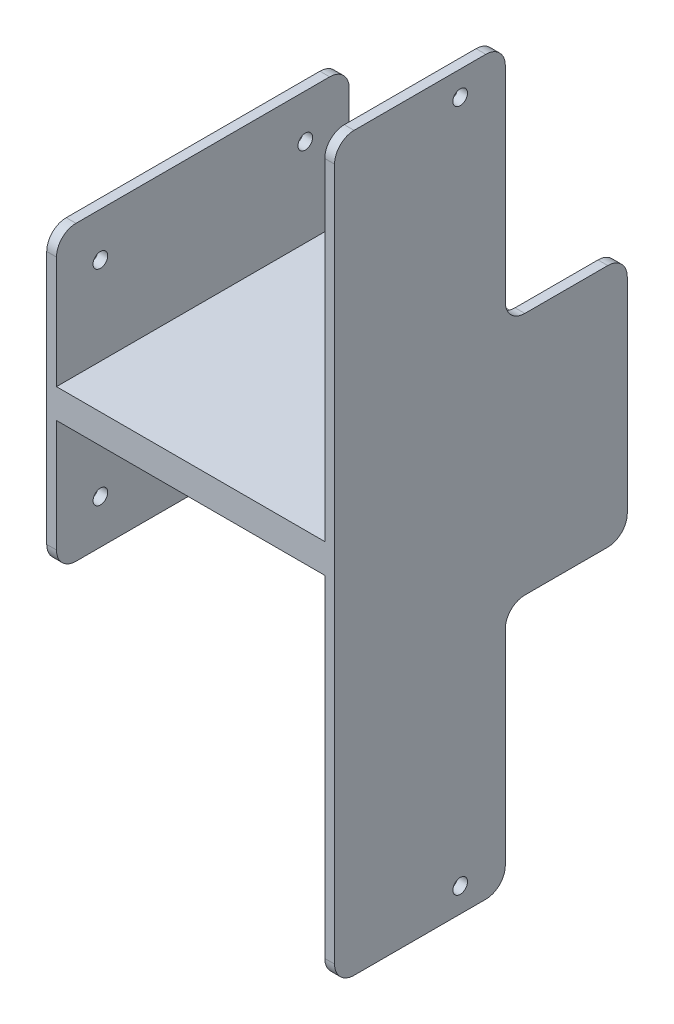
ISO-10303-21;
HEADER;
FILE_DESCRIPTION(('STEP AP214'),'2;1');
FILE_NAME('part.step','',(''),(''),'','','');
FILE_SCHEMA(('AUTOMOTIVE_DESIGN { 1 0 10303 214 1 1 1 1 }'));
ENDSEC;
DATA;
#1=APPLICATION_CONTEXT('core data for automotive mechanical design processes');
#2=APPLICATION_PROTOCOL_DEFINITION('international standard','automotive_design',2000,#1);
#3=PRODUCT_CONTEXT('',#1,'mechanical');
#4=PRODUCT('Part','Part','',(#3));
#5=PRODUCT_RELATED_PRODUCT_CATEGORY('part','',(#4));
#6=PRODUCT_DEFINITION_FORMATION('','',#4);
#7=PRODUCT_DEFINITION_CONTEXT('part definition',#1,'design');
#8=PRODUCT_DEFINITION('design','',#6,#7);
#9=PRODUCT_DEFINITION_SHAPE('','',#8);
#10=(LENGTH_UNIT() NAMED_UNIT(*) SI_UNIT(.MILLI.,.METRE.));
#11=(NAMED_UNIT(*) PLANE_ANGLE_UNIT() SI_UNIT($,.RADIAN.));
#12=(NAMED_UNIT(*) SI_UNIT($,.STERADIAN.) SOLID_ANGLE_UNIT());
#13=UNCERTAINTY_MEASURE_WITH_UNIT(LENGTH_MEASURE(1.E-05),#10,'distance_accuracy_value','');
#14=(GEOMETRIC_REPRESENTATION_CONTEXT(3) GLOBAL_UNCERTAINTY_ASSIGNED_CONTEXT((#13)) GLOBAL_UNIT_ASSIGNED_CONTEXT((#10,
#11,#12)) REPRESENTATION_CONTEXT('',''));
#15=CARTESIAN_POINT('',(0.,0.,0.));
#16=DIRECTION('',(0.,0.,1.));
#17=DIRECTION('',(1.,0.,0.));
#18=AXIS2_PLACEMENT_3D('',#15,#16,#17);
#19=CARTESIAN_POINT('',(-29.5,30.,60.));
#20=DIRECTION('',(1.,0.,0.));
#21=DIRECTION('',(0.,1.,0.));
#22=AXIS2_PLACEMENT_3D('',#19,#20,#21);
#23=PLANE('',#22);
#24=CARTESIAN_POINT('',(-29.5,-21.,51.));
#25=DIRECTION('',(-1.,0.,0.));
#26=DIRECTION('',(0.,-1.,0.));
#27=AXIS2_PLACEMENT_3D('',#24,#25,#26);
#28=CIRCLE('',#27,1.5);
#29=CARTESIAN_POINT('',(-29.5,-22.5,51.));
#30=VERTEX_POINT('',#29);
#31=EDGE_CURVE('E508',#30,#30,#28,.T.);
#32=ORIENTED_EDGE('',*,*,#31,.F.);
#33=EDGE_LOOP('',(#32));
#34=FACE_BOUND('',#33,.T.);
#35=CARTESIAN_POINT('',(-29.5,21.,9.));
#36=DIRECTION('',(-1.,0.,0.));
#37=DIRECTION('',(0.,-1.,0.));
#38=AXIS2_PLACEMENT_3D('',#35,#36,#37);
#39=CIRCLE('',#38,1.5);
#40=CARTESIAN_POINT('',(-29.5,19.5,9.));
#41=VERTEX_POINT('',#40);
#42=EDGE_CURVE('E509',#41,#41,#39,.T.);
#43=ORIENTED_EDGE('',*,*,#42,.F.);
#44=EDGE_LOOP('',(#43));
#45=FACE_BOUND('',#44,.T.);
#46=CARTESIAN_POINT('',(-29.5,-21.,9.00000000000001));
#47=DIRECTION('',(-1.,0.,0.));
#48=DIRECTION('',(0.,-1.,0.));
#49=AXIS2_PLACEMENT_3D('',#46,#47,#48);
#50=CIRCLE('',#49,1.5);
#51=CARTESIAN_POINT('',(-29.5,-22.5,9.00000000000001));
#52=VERTEX_POINT('',#51);
#53=EDGE_CURVE('E512',#52,#52,#50,.T.);
#54=ORIENTED_EDGE('',*,*,#53,.F.);
#55=EDGE_LOOP('',(#54));
#56=FACE_BOUND('',#55,.T.);
#57=CARTESIAN_POINT('',(-29.5,21.,51.));
#58=DIRECTION('',(-1.,0.,0.));
#59=DIRECTION('',(0.,-1.,0.));
#60=AXIS2_PLACEMENT_3D('',#57,#58,#59);
#61=CIRCLE('',#60,1.5);
#62=CARTESIAN_POINT('',(-29.5,19.5,51.));
#63=VERTEX_POINT('',#62);
#64=EDGE_CURVE('E318',#63,#63,#61,.T.);
#65=ORIENTED_EDGE('',*,*,#64,.F.);
#66=EDGE_LOOP('',(#65));
#67=FACE_BOUND('',#66,.T.);
#68=DIRECTION('',(0.,-1.,0.));
#69=VECTOR('',#68,1.);
#70=CARTESIAN_POINT('',(-29.5,30.,60.));
#71=LINE('',#70,#69);
#72=CARTESIAN_POINT('',(-29.5,26.,60.));
#73=VERTEX_POINT('',#72);
#74=CARTESIAN_POINT('',(-29.5,-26.,60.));
#75=VERTEX_POINT('',#74);
#76=EDGE_CURVE('E234',#73,#75,#71,.T.);
#77=ORIENTED_EDGE('',*,*,#76,.F.);
#78=CARTESIAN_POINT('',(-29.5,26.,56.));
#79=DIRECTION('',(1.,0.,0.));
#80=DIRECTION('',(0.,1.,0.));
#81=AXIS2_PLACEMENT_3D('',#78,#79,#80);
#82=CIRCLE('',#81,4.);
#83=CARTESIAN_POINT('',(-29.5,30.,56.));
#84=VERTEX_POINT('',#83);
#85=EDGE_CURVE('E355',#73,#84,#82,.F.);
#86=ORIENTED_EDGE('',*,*,#85,.T.);
#87=DIRECTION('',(0.,0.,-1.));
#88=VECTOR('',#87,1.);
#89=CARTESIAN_POINT('',(-29.5,30.,60.));
#90=LINE('',#89,#88);
#91=CARTESIAN_POINT('',(-29.5,30.,4.));
#92=VERTEX_POINT('',#91);
#93=EDGE_CURVE('E263',#84,#92,#90,.T.);
#94=ORIENTED_EDGE('',*,*,#93,.T.);
#95=CARTESIAN_POINT('',(-29.5,26.,4.));
#96=DIRECTION('',(1.,0.,0.));
#97=DIRECTION('',(0.,1.,0.));
#98=AXIS2_PLACEMENT_3D('',#95,#96,#97);
#99=CIRCLE('',#98,4.);
#100=CARTESIAN_POINT('',(-29.5,26.,0.));
#101=VERTEX_POINT('',#100);
#102=EDGE_CURVE('E351',#92,#101,#99,.F.);
#103=ORIENTED_EDGE('',*,*,#102,.T.);
#104=DIRECTION('',(0.,-1.,0.));
#105=VECTOR('',#104,1.);
#106=CARTESIAN_POINT('',(-29.5,30.,0.));
#107=LINE('',#106,#105);
#108=CARTESIAN_POINT('',(-29.5,-26.,0.));
#109=VERTEX_POINT('',#108);
#110=EDGE_CURVE('E264',#101,#109,#107,.T.);
#111=ORIENTED_EDGE('',*,*,#110,.T.);
#112=CARTESIAN_POINT('',(-29.5,-26.,4.));
#113=DIRECTION('',(1.,0.,0.));
#114=DIRECTION('',(0.,1.,0.));
#115=AXIS2_PLACEMENT_3D('',#112,#113,#114);
#116=CIRCLE('',#115,4.);
#117=CARTESIAN_POINT('',(-29.5,-30.,4.));
#118=VERTEX_POINT('',#117);
#119=EDGE_CURVE('E349',#109,#118,#116,.F.);
#120=ORIENTED_EDGE('',*,*,#119,.T.);
#121=DIRECTION('',(0.,0.,-1.));
#122=VECTOR('',#121,1.);
#123=CARTESIAN_POINT('',(-29.5,-30.,60.));
#124=LINE('',#123,#122);
#125=CARTESIAN_POINT('',(-29.5,-30.,56.));
#126=VERTEX_POINT('',#125);
#127=EDGE_CURVE('E310',#126,#118,#124,.T.);
#128=ORIENTED_EDGE('',*,*,#127,.F.);
#129=CARTESIAN_POINT('',(-29.5,-26.,56.));
#130=DIRECTION('',(1.,0.,0.));
#131=DIRECTION('',(0.,1.,0.));
#132=AXIS2_PLACEMENT_3D('',#129,#130,#131);
#133=CIRCLE('',#132,4.);
#134=EDGE_CURVE('E353',#126,#75,#133,.F.);
#135=ORIENTED_EDGE('',*,*,#134,.T.);
#136=EDGE_LOOP('',(#77,#86,#94,#103,#111,#120,#128,#135));
#137=FACE_BOUND('',#136,.T.);
#138=ADVANCED_FACE('F37',(#34,#45,#56,#67,#137),#23,.F.);
#139=CARTESIAN_POINT('',(-29.5,-30.,60.));
#140=DIRECTION('',(0.,1.,0.));
#141=DIRECTION('',(-1.,0.,0.));
#142=AXIS2_PLACEMENT_3D('',#139,#140,#141);
#143=PLANE('',#142);
#144=DIRECTION('',(0.,0.,-1.));
#145=VECTOR('',#144,1.);
#146=CARTESIAN_POINT('',(-27.5,-30.,60.));
#147=LINE('',#146,#145);
#148=CARTESIAN_POINT('',(-27.5,-30.,56.));
#149=VERTEX_POINT('',#148);
#150=CARTESIAN_POINT('',(-27.5,-30.,4.));
#151=VERTEX_POINT('',#150);
#152=EDGE_CURVE('E243',#149,#151,#147,.T.);
#153=ORIENTED_EDGE('',*,*,#152,.F.);
#154=DIRECTION('',(1.,0.,0.));
#155=VECTOR('',#154,1.);
#156=CARTESIAN_POINT('',(-29.5,-30.,56.));
#157=LINE('',#156,#155);
#158=EDGE_CURVE('E373',#149,#126,#157,.F.);
#159=ORIENTED_EDGE('',*,*,#158,.T.);
#160=ORIENTED_EDGE('',*,*,#127,.T.);
#161=DIRECTION('',(1.,0.,0.));
#162=VECTOR('',#161,1.);
#163=CARTESIAN_POINT('',(-29.5,-30.,4.));
#164=LINE('',#163,#162);
#165=EDGE_CURVE('E370',#118,#151,#164,.T.);
#166=ORIENTED_EDGE('',*,*,#165,.T.);
#167=EDGE_LOOP('',(#153,#159,#160,#166));
#168=FACE_BOUND('',#167,.T.);
#169=ADVANCED_FACE('F501',(#168),#143,.F.);
#170=CARTESIAN_POINT('',(-27.5,-3.,60.));
#171=DIRECTION('',(-1.,0.,0.));
#172=DIRECTION('',(0.,-1.,0.));
#173=AXIS2_PLACEMENT_3D('',#170,#171,#172);
#174=PLANE('',#173);
#175=CARTESIAN_POINT('',(-27.5,-21.,51.));
#176=DIRECTION('',(-1.,0.,0.));
#177=DIRECTION('',(0.,-1.,0.));
#178=AXIS2_PLACEMENT_3D('',#175,#176,#177);
#179=CIRCLE('',#178,1.5);
#180=CARTESIAN_POINT('',(-27.5,-22.5,51.));
#181=VERTEX_POINT('',#180);
#182=EDGE_CURVE('E267',#181,#181,#179,.T.);
#183=ORIENTED_EDGE('',*,*,#182,.T.);
#184=EDGE_LOOP('',(#183));
#185=FACE_BOUND('',#184,.T.);
#186=CARTESIAN_POINT('',(-27.5,-21.,9.00000000000001));
#187=DIRECTION('',(-1.,0.,0.));
#188=DIRECTION('',(0.,-1.,0.));
#189=AXIS2_PLACEMENT_3D('',#186,#187,#188);
#190=CIRCLE('',#189,1.5);
#191=CARTESIAN_POINT('',(-27.5,-22.5,9.00000000000001));
#192=VERTEX_POINT('',#191);
#193=EDGE_CURVE('E321',#192,#192,#190,.T.);
#194=ORIENTED_EDGE('',*,*,#193,.T.);
#195=EDGE_LOOP('',(#194));
#196=FACE_BOUND('',#195,.T.);
#197=DIRECTION('',(0.,1.,0.));
#198=VECTOR('',#197,1.);
#199=CARTESIAN_POINT('',(-27.5,-3.,60.));
#200=LINE('',#199,#198);
#201=CARTESIAN_POINT('',(-27.5,-26.,60.));
#202=VERTEX_POINT('',#201);
#203=CARTESIAN_POINT('',(-27.5,-3.,60.));
#204=VERTEX_POINT('',#203);
#205=EDGE_CURVE('E222',#202,#204,#200,.T.);
#206=ORIENTED_EDGE('',*,*,#205,.F.);
#207=CARTESIAN_POINT('',(-27.5,-26.,56.));
#208=DIRECTION('',(-1.,0.,0.));
#209=DIRECTION('',(0.,-1.,0.));
#210=AXIS2_PLACEMENT_3D('',#207,#208,#209);
#211=CIRCLE('',#210,4.);
#212=EDGE_CURVE('E368',#202,#149,#211,.F.);
#213=ORIENTED_EDGE('',*,*,#212,.T.);
#214=ORIENTED_EDGE('',*,*,#152,.T.);
#215=CARTESIAN_POINT('',(-27.5,-26.,4.));
#216=DIRECTION('',(-1.,0.,0.));
#217=DIRECTION('',(0.,-1.,0.));
#218=AXIS2_PLACEMENT_3D('',#215,#216,#217);
#219=CIRCLE('',#218,4.);
#220=CARTESIAN_POINT('',(-27.5,-26.,0.));
#221=VERTEX_POINT('',#220);
#222=EDGE_CURVE('E366',#151,#221,#219,.F.);
#223=ORIENTED_EDGE('',*,*,#222,.T.);
#224=DIRECTION('',(0.,1.,0.));
#225=VECTOR('',#224,1.);
#226=CARTESIAN_POINT('',(-27.5,-3.,0.));
#227=LINE('',#226,#225);
#228=CARTESIAN_POINT('',(-27.5,-3.,0.));
#229=VERTEX_POINT('',#228);
#230=EDGE_CURVE('E240',#221,#229,#227,.T.);
#231=ORIENTED_EDGE('',*,*,#230,.T.);
#232=DIRECTION('',(0.,0.,-1.));
#233=VECTOR('',#232,1.);
#234=CARTESIAN_POINT('',(-27.5,-3.,60.));
#235=LINE('',#234,#233);
#236=EDGE_CURVE('E237',#204,#229,#235,.T.);
#237=ORIENTED_EDGE('',*,*,#236,.F.);
#238=EDGE_LOOP('',(#206,#213,#214,#223,#231,#237));
#239=FACE_BOUND('',#238,.T.);
#240=ADVANCED_FACE('F238',(#185,#196,#239),#174,.F.);
#241=CARTESIAN_POINT('',(-27.5,-3.,60.));
#242=DIRECTION('',(0.,1.,0.));
#243=DIRECTION('',(0.,0.,1.));
#244=AXIS2_PLACEMENT_3D('',#241,#242,#243);
#245=PLANE('',#244);
#246=DIRECTION('',(1.,0.,0.));
#247=VECTOR('',#246,1.);
#248=CARTESIAN_POINT('',(-27.5,-3.,0.));
#249=LINE('',#248,#247);
#250=CARTESIAN_POINT('',(27.5,-3.,0.));
#251=VERTEX_POINT('',#250);
#252=EDGE_CURVE('E269',#229,#251,#249,.T.);
#253=ORIENTED_EDGE('',*,*,#252,.T.);
#254=DIRECTION('',(0.,0.,-1.));
#255=VECTOR('',#254,1.);
#256=CARTESIAN_POINT('',(27.5,-3.,60.));
#257=LINE('',#256,#255);
#258=CARTESIAN_POINT('',(27.5,-3.,60.));
#259=VERTEX_POINT('',#258);
#260=EDGE_CURVE('E244',#259,#251,#257,.T.);
#261=ORIENTED_EDGE('',*,*,#260,.F.);
#262=DIRECTION('',(1.,0.,0.));
#263=VECTOR('',#262,1.);
#264=CARTESIAN_POINT('',(-27.5,-3.,60.));
#265=LINE('',#264,#263);
#266=EDGE_CURVE('E228',#204,#259,#265,.T.);
#267=ORIENTED_EDGE('',*,*,#266,.F.);
#268=ORIENTED_EDGE('',*,*,#236,.T.);
#269=EDGE_LOOP('',(#253,#261,#267,#268));
#270=FACE_BOUND('',#269,.T.);
#271=ADVANCED_FACE('F246',(#270),#245,.F.);
#272=CARTESIAN_POINT('',(27.5,-3.,60.));
#273=DIRECTION('',(1.,0.,0.));
#274=DIRECTION('',(0.,1.,0.));
#275=AXIS2_PLACEMENT_3D('',#272,#273,#274);
#276=PLANE('',#275);
#277=CARTESIAN_POINT('',(27.5,-70.,34.25));
#278=DIRECTION('',(-1.,0.,0.));
#279=DIRECTION('',(0.,1.,0.));
#280=AXIS2_PLACEMENT_3D('',#277,#278,#279);
#281=CIRCLE('',#280,1.5);
#282=CARTESIAN_POINT('',(27.5,-68.5,34.25));
#283=VERTEX_POINT('',#282);
#284=EDGE_CURVE('E535',#283,#283,#281,.T.);
#285=ORIENTED_EDGE('',*,*,#284,.F.);
#286=EDGE_LOOP('',(#285));
#287=FACE_BOUND('',#286,.T.);
#288=DIRECTION('',(0.,0.,1.));
#289=VECTOR('',#288,1.);
#290=CARTESIAN_POINT('',(27.5,-74.9999999999965,25.));
#291=LINE('',#290,#289);
#292=CARTESIAN_POINT('',(27.5,-74.9999999999965,29.));
#293=VERTEX_POINT('',#292);
#294=CARTESIAN_POINT('',(27.5,-74.9999999999965,56.));
#295=VERTEX_POINT('',#294);
#296=EDGE_CURVE('E523',#293,#295,#291,.T.);
#297=ORIENTED_EDGE('',*,*,#296,.T.);
#298=CARTESIAN_POINT('',(27.5,-70.9999999999965,56.));
#299=DIRECTION('',(1.,0.,0.));
#300=DIRECTION('',(0.,1.,0.));
#301=AXIS2_PLACEMENT_3D('',#298,#299,#300);
#302=CIRCLE('',#301,4.);
#303=CARTESIAN_POINT('',(27.5,-70.9999999999965,60.));
#304=VERTEX_POINT('',#303);
#305=EDGE_CURVE('E406',#295,#304,#302,.F.);
#306=ORIENTED_EDGE('',*,*,#305,.T.);
#307=DIRECTION('',(0.,-1.,0.));
#308=VECTOR('',#307,1.);
#309=CARTESIAN_POINT('',(27.5,-3.,60.));
#310=LINE('',#309,#308);
#311=EDGE_CURVE('E249',#259,#304,#310,.T.);
#312=ORIENTED_EDGE('',*,*,#311,.F.);
#313=ORIENTED_EDGE('',*,*,#260,.T.);
#314=DIRECTION('',(0.,-1.,0.));
#315=VECTOR('',#314,1.);
#316=CARTESIAN_POINT('',(27.5,-3.,0.));
#317=LINE('',#316,#315);
#318=CARTESIAN_POINT('',(27.5,-21.,0.));
#319=VERTEX_POINT('',#318);
#320=EDGE_CURVE('E271',#251,#319,#317,.T.);
#321=ORIENTED_EDGE('',*,*,#320,.T.);
#322=CARTESIAN_POINT('',(27.5,-21.,4.));
#323=DIRECTION('',(1.,0.,0.));
#324=DIRECTION('',(0.,1.,0.));
#325=AXIS2_PLACEMENT_3D('',#322,#323,#324);
#326=CIRCLE('',#325,4.);
#327=CARTESIAN_POINT('',(27.5,-25.,4.));
#328=VERTEX_POINT('',#327);
#329=EDGE_CURVE('E403',#319,#328,#326,.F.);
#330=ORIENTED_EDGE('',*,*,#329,.T.);
#331=DIRECTION('',(0.,0.,-1.));
#332=VECTOR('',#331,1.);
#333=CARTESIAN_POINT('',(27.5,-25.,60.));
#334=LINE('',#333,#332);
#335=CARTESIAN_POINT('',(27.5,-25.,21.));
#336=VERTEX_POINT('',#335);
#337=EDGE_CURVE('E304',#336,#328,#334,.T.);
#338=ORIENTED_EDGE('',*,*,#337,.F.);
#339=CARTESIAN_POINT('',(27.5,-29.,21.));
#340=DIRECTION('',(1.,0.,0.));
#341=DIRECTION('',(0.,1.,0.));
#342=AXIS2_PLACEMENT_3D('',#339,#340,#341);
#343=CIRCLE('',#342,4.);
#344=CARTESIAN_POINT('',(27.5,-29.,25.));
#345=VERTEX_POINT('',#344);
#346=EDGE_CURVE('E45',#336,#345,#343,.T.);
#347=ORIENTED_EDGE('',*,*,#346,.T.);
#348=DIRECTION('',(0.,-1.,0.));
#349=VECTOR('',#348,1.);
#350=CARTESIAN_POINT('',(27.5,-24.9999999999965,25.));
#351=LINE('',#350,#349);
#352=CARTESIAN_POINT('',(27.5,-70.9999999999965,25.));
#353=VERTEX_POINT('',#352);
#354=EDGE_CURVE('E329',#345,#353,#351,.T.);
#355=ORIENTED_EDGE('',*,*,#354,.T.);
#356=CARTESIAN_POINT('',(27.5,-70.9999999999965,29.));
#357=DIRECTION('',(1.,0.,0.));
#358=DIRECTION('',(0.,1.,0.));
#359=AXIS2_PLACEMENT_3D('',#356,#357,#358);
#360=CIRCLE('',#359,4.);
#361=EDGE_CURVE('E52',#353,#293,#360,.F.);
#362=ORIENTED_EDGE('',*,*,#361,.T.);
#363=EDGE_LOOP('',(#297,#306,#312,#313,#321,#330,#338,#347,#355,#362));
#364=FACE_BOUND('',#363,.T.);
#365=ADVANCED_FACE('F779',(#287,#364),#276,.F.);
#366=CARTESIAN_POINT('',(27.5,-25.,60.));
#367=DIRECTION('',(0.,1.,0.));
#368=DIRECTION('',(0.,0.,1.));
#369=AXIS2_PLACEMENT_3D('',#366,#367,#368);
#370=PLANE('',#369);
#371=DIRECTION('',(0.,0.,-1.));
#372=VECTOR('',#371,1.);
#373=CARTESIAN_POINT('',(29.5,-25.,60.));
#374=LINE('',#373,#372);
#375=CARTESIAN_POINT('',(29.5,-25.,21.));
#376=VERTEX_POINT('',#375);
#377=CARTESIAN_POINT('',(29.5,-25.,4.));
#378=VERTEX_POINT('',#377);
#379=EDGE_CURVE('E301',#376,#378,#374,.T.);
#380=ORIENTED_EDGE('',*,*,#379,.F.);
#381=DIRECTION('',(-1.,0.,0.));
#382=VECTOR('',#381,1.);
#383=CARTESIAN_POINT('',(27.5,-25.,21.));
#384=LINE('',#383,#382);
#385=EDGE_CURVE('E415',#376,#336,#384,.T.);
#386=ORIENTED_EDGE('',*,*,#385,.T.);
#387=ORIENTED_EDGE('',*,*,#337,.T.);
#388=DIRECTION('',(1.,0.,0.));
#389=VECTOR('',#388,1.);
#390=CARTESIAN_POINT('',(27.5,-25.,4.));
#391=LINE('',#390,#389);
#392=EDGE_CURVE('E412',#328,#378,#391,.T.);
#393=ORIENTED_EDGE('',*,*,#392,.T.);
#394=EDGE_LOOP('',(#380,#386,#387,#393));
#395=FACE_BOUND('',#394,.T.);
#396=ADVANCED_FACE('F768',(#395),#370,.F.);
#397=CARTESIAN_POINT('',(29.5,25.,60.));
#398=DIRECTION('',(-1.,0.,0.));
#399=DIRECTION('',(0.,-1.,0.));
#400=AXIS2_PLACEMENT_3D('',#397,#398,#399);
#401=PLANE('',#400);
#402=CARTESIAN_POINT('',(29.5,70.,34.25));
#403=DIRECTION('',(-1.,0.,0.));
#404=DIRECTION('',(0.,-1.,0.));
#405=AXIS2_PLACEMENT_3D('',#402,#403,#404);
#406=CIRCLE('',#405,1.5);
#407=CARTESIAN_POINT('',(29.5,68.5,34.25));
#408=VERTEX_POINT('',#407);
#409=EDGE_CURVE('E330',#408,#408,#406,.T.);
#410=ORIENTED_EDGE('',*,*,#409,.T.);
#411=EDGE_LOOP('',(#410));
#412=FACE_BOUND('',#411,.T.);
#413=CARTESIAN_POINT('',(29.5,-70.,34.25));
#414=DIRECTION('',(-1.,0.,0.));
#415=DIRECTION('',(0.,-1.,0.));
#416=AXIS2_PLACEMENT_3D('',#413,#414,#415);
#417=CIRCLE('',#416,1.5);
#418=CARTESIAN_POINT('',(29.5,-71.5,34.25));
#419=VERTEX_POINT('',#418);
#420=EDGE_CURVE('E326',#419,#419,#417,.T.);
#421=ORIENTED_EDGE('',*,*,#420,.T.);
#422=EDGE_LOOP('',(#421));
#423=FACE_BOUND('',#422,.T.);
#424=DIRECTION('',(0.,0.,-1.));
#425=VECTOR('',#424,1.);
#426=CARTESIAN_POINT('',(29.5,74.9999999999965,25.));
#427=LINE('',#426,#425);
#428=CARTESIAN_POINT('',(29.5,74.9999999999965,56.));
#429=VERTEX_POINT('',#428);
#430=CARTESIAN_POINT('',(29.5,74.9999999999965,29.));
#431=VERTEX_POINT('',#430);
#432=EDGE_CURVE('E446',#429,#431,#427,.T.);
#433=ORIENTED_EDGE('',*,*,#432,.F.);
#434=CARTESIAN_POINT('',(29.5,70.9999999999965,56.));
#435=DIRECTION('',(-1.,0.,0.));
#436=DIRECTION('',(0.,-1.,0.));
#437=AXIS2_PLACEMENT_3D('',#434,#435,#436);
#438=CIRCLE('',#437,4.);
#439=CARTESIAN_POINT('',(29.5,70.9999999999965,60.));
#440=VERTEX_POINT('',#439);
#441=EDGE_CURVE('E396',#429,#440,#438,.F.);
#442=ORIENTED_EDGE('',*,*,#441,.T.);
#443=DIRECTION('',(0.,1.,0.));
#444=VECTOR('',#443,1.);
#445=CARTESIAN_POINT('',(29.5,25.,60.));
#446=LINE('',#445,#444);
#447=CARTESIAN_POINT('',(29.5,-70.9999999999965,60.));
#448=VERTEX_POINT('',#447);
#449=EDGE_CURVE('E251',#448,#440,#446,.T.);
#450=ORIENTED_EDGE('',*,*,#449,.F.);
#451=CARTESIAN_POINT('',(29.5,-70.9999999999965,56.));
#452=DIRECTION('',(-1.,0.,0.));
#453=DIRECTION('',(0.,-1.,0.));
#454=AXIS2_PLACEMENT_3D('',#451,#452,#453);
#455=CIRCLE('',#454,4.);
#456=CARTESIAN_POINT('',(29.5,-74.9999999999965,56.));
#457=VERTEX_POINT('',#456);
#458=EDGE_CURVE('E392',#448,#457,#455,.F.);
#459=ORIENTED_EDGE('',*,*,#458,.T.);
#460=DIRECTION('',(0.,0.,1.));
#461=VECTOR('',#460,1.);
#462=CARTESIAN_POINT('',(29.5,-74.9999999999965,25.));
#463=LINE('',#462,#461);
#464=CARTESIAN_POINT('',(29.5,-74.9999999999965,29.));
#465=VERTEX_POINT('',#464);
#466=EDGE_CURVE('E520',#465,#457,#463,.T.);
#467=ORIENTED_EDGE('',*,*,#466,.F.);
#468=CARTESIAN_POINT('',(29.5,-70.9999999999965,29.));
#469=DIRECTION('',(-1.,0.,0.));
#470=DIRECTION('',(0.,-1.,0.));
#471=AXIS2_PLACEMENT_3D('',#468,#469,#470);
#472=CIRCLE('',#471,4.);
#473=CARTESIAN_POINT('',(29.5,-70.9999999999965,25.));
#474=VERTEX_POINT('',#473);
#475=EDGE_CURVE('E390',#465,#474,#472,.F.);
#476=ORIENTED_EDGE('',*,*,#475,.T.);
#477=DIRECTION('',(0.,-1.,0.));
#478=VECTOR('',#477,1.);
#479=CARTESIAN_POINT('',(29.5,-24.9999999999965,25.));
#480=LINE('',#479,#478);
#481=CARTESIAN_POINT('',(29.5,-29.,25.));
#482=VERTEX_POINT('',#481);
#483=EDGE_CURVE('E526',#482,#474,#480,.T.);
#484=ORIENTED_EDGE('',*,*,#483,.F.);
#485=CARTESIAN_POINT('',(29.5,-29.,21.));
#486=DIRECTION('',(-1.,0.,0.));
#487=DIRECTION('',(0.,-1.,0.));
#488=AXIS2_PLACEMENT_3D('',#485,#486,#487);
#489=CIRCLE('',#488,4.);
#490=EDGE_CURVE('E11',#482,#376,#489,.T.);
#491=ORIENTED_EDGE('',*,*,#490,.T.);
#492=ORIENTED_EDGE('',*,*,#379,.T.);
#493=CARTESIAN_POINT('',(29.5,-21.,4.));
#494=DIRECTION('',(-1.,0.,0.));
#495=DIRECTION('',(0.,-1.,0.));
#496=AXIS2_PLACEMENT_3D('',#493,#494,#495);
#497=CIRCLE('',#496,4.);
#498=CARTESIAN_POINT('',(29.5,-21.,0.));
#499=VERTEX_POINT('',#498);
#500=EDGE_CURVE('E386',#378,#499,#497,.F.);
#501=ORIENTED_EDGE('',*,*,#500,.T.);
#502=DIRECTION('',(0.,1.,0.));
#503=VECTOR('',#502,1.);
#504=CARTESIAN_POINT('',(29.5,25.,0.));
#505=LINE('',#504,#503);
#506=CARTESIAN_POINT('',(29.5,21.,0.));
#507=VERTEX_POINT('',#506);
#508=EDGE_CURVE('E274',#499,#507,#505,.T.);
#509=ORIENTED_EDGE('',*,*,#508,.T.);
#510=CARTESIAN_POINT('',(29.5,21.,4.));
#511=DIRECTION('',(-1.,0.,0.));
#512=DIRECTION('',(0.,-1.,0.));
#513=AXIS2_PLACEMENT_3D('',#510,#511,#512);
#514=CIRCLE('',#513,4.);
#515=CARTESIAN_POINT('',(29.5,25.,4.));
#516=VERTEX_POINT('',#515);
#517=EDGE_CURVE('E388',#507,#516,#514,.F.);
#518=ORIENTED_EDGE('',*,*,#517,.T.);
#519=DIRECTION('',(0.,0.,-1.));
#520=VECTOR('',#519,1.);
#521=CARTESIAN_POINT('',(29.5,25.,60.));
#522=LINE('',#521,#520);
#523=CARTESIAN_POINT('',(29.5,25.,21.));
#524=VERTEX_POINT('',#523);
#525=EDGE_CURVE('E298',#524,#516,#522,.T.);
#526=ORIENTED_EDGE('',*,*,#525,.F.);
#527=CARTESIAN_POINT('',(29.5,29.,21.));
#528=DIRECTION('',(-1.,0.,0.));
#529=DIRECTION('',(0.,-1.,0.));
#530=AXIS2_PLACEMENT_3D('',#527,#528,#529);
#531=CIRCLE('',#530,4.);
#532=CARTESIAN_POINT('',(29.5,29.,25.));
#533=VERTEX_POINT('',#532);
#534=EDGE_CURVE('E428',#524,#533,#531,.T.);
#535=ORIENTED_EDGE('',*,*,#534,.T.);
#536=DIRECTION('',(0.,-1.,0.));
#537=VECTOR('',#536,1.);
#538=CARTESIAN_POINT('',(29.5,24.9999999999964,25.));
#539=LINE('',#538,#537);
#540=CARTESIAN_POINT('',(29.5,70.9999999999965,25.));
#541=VERTEX_POINT('',#540);
#542=EDGE_CURVE('E436',#541,#533,#539,.T.);
#543=ORIENTED_EDGE('',*,*,#542,.F.);
#544=CARTESIAN_POINT('',(29.5,70.9999999999965,29.));
#545=DIRECTION('',(-1.,0.,0.));
#546=DIRECTION('',(0.,-1.,0.));
#547=AXIS2_PLACEMENT_3D('',#544,#545,#546);
#548=CIRCLE('',#547,4.);
#549=EDGE_CURVE('E394',#541,#431,#548,.F.);
#550=ORIENTED_EDGE('',*,*,#549,.T.);
#551=EDGE_LOOP('',(#433,#442,#450,#459,#467,#476,#484,#491,#492,#501,#509,#518,#526,#535,#543,#550));
#552=FACE_BOUND('',#551,.T.);
#553=ADVANCED_FACE('F435',(#412,#423,#552),#401,.F.);
#554=CARTESIAN_POINT('',(27.5,25.,60.));
#555=DIRECTION('',(0.,-1.,0.));
#556=DIRECTION('',(0.,0.,-1.));
#557=AXIS2_PLACEMENT_3D('',#554,#555,#556);
#558=PLANE('',#557);
#559=DIRECTION('',(0.,0.,-1.));
#560=VECTOR('',#559,1.);
#561=CARTESIAN_POINT('',(27.5,25.,60.));
#562=LINE('',#561,#560);
#563=CARTESIAN_POINT('',(27.5,25.,21.));
#564=VERTEX_POINT('',#563);
#565=CARTESIAN_POINT('',(27.5,25.,4.));
#566=VERTEX_POINT('',#565);
#567=EDGE_CURVE('E295',#564,#566,#562,.T.);
#568=ORIENTED_EDGE('',*,*,#567,.F.);
#569=DIRECTION('',(-1.,0.,0.));
#570=VECTOR('',#569,1.);
#571=CARTESIAN_POINT('',(27.5,25.,21.));
#572=LINE('',#571,#570);
#573=EDGE_CURVE('E338',#564,#524,#572,.F.);
#574=ORIENTED_EDGE('',*,*,#573,.T.);
#575=ORIENTED_EDGE('',*,*,#525,.T.);
#576=DIRECTION('',(-1.,0.,0.));
#577=VECTOR('',#576,1.);
#578=CARTESIAN_POINT('',(27.5,25.,4.));
#579=LINE('',#578,#577);
#580=EDGE_CURVE('E335',#516,#566,#579,.T.);
#581=ORIENTED_EDGE('',*,*,#580,.T.);
#582=EDGE_LOOP('',(#568,#574,#575,#581));
#583=FACE_BOUND('',#582,.T.);
#584=ADVANCED_FACE('F456',(#583),#558,.F.);
#585=CARTESIAN_POINT('',(27.5,25.,60.));
#586=DIRECTION('',(1.,0.,0.));
#587=DIRECTION('',(0.,1.,0.));
#588=AXIS2_PLACEMENT_3D('',#585,#586,#587);
#589=PLANE('',#588);
#590=CARTESIAN_POINT('',(27.5,70.,34.25));
#591=DIRECTION('',(-1.,0.,0.));
#592=DIRECTION('',(0.,-1.,0.));
#593=AXIS2_PLACEMENT_3D('',#590,#591,#592);
#594=CIRCLE('',#593,1.5);
#595=CARTESIAN_POINT('',(27.5,68.5,34.25));
#596=VERTEX_POINT('',#595);
#597=EDGE_CURVE('E534',#596,#596,#594,.T.);
#598=ORIENTED_EDGE('',*,*,#597,.F.);
#599=EDGE_LOOP('',(#598));
#600=FACE_BOUND('',#599,.T.);
#601=DIRECTION('',(0.,-1.,0.));
#602=VECTOR('',#601,1.);
#603=CARTESIAN_POINT('',(27.5,25.,60.));
#604=LINE('',#603,#602);
#605=CARTESIAN_POINT('',(27.5,70.9999999999965,60.));
#606=VERTEX_POINT('',#605);
#607=CARTESIAN_POINT('',(27.5,3.,60.));
#608=VERTEX_POINT('',#607);
#609=EDGE_CURVE('E257',#606,#608,#604,.T.);
#610=ORIENTED_EDGE('',*,*,#609,.F.);
#611=CARTESIAN_POINT('',(27.5,70.9999999999965,56.));
#612=DIRECTION('',(1.,0.,0.));
#613=DIRECTION('',(0.,1.,0.));
#614=AXIS2_PLACEMENT_3D('',#611,#612,#613);
#615=CIRCLE('',#614,4.);
#616=CARTESIAN_POINT('',(27.5,74.9999999999965,56.));
#617=VERTEX_POINT('',#616);
#618=EDGE_CURVE('E379',#606,#617,#615,.F.);
#619=ORIENTED_EDGE('',*,*,#618,.T.);
#620=DIRECTION('',(0.,0.,-1.));
#621=VECTOR('',#620,1.);
#622=CARTESIAN_POINT('',(27.5,74.9999999999965,25.));
#623=LINE('',#622,#621);
#624=CARTESIAN_POINT('',(27.5,74.9999999999965,29.));
#625=VERTEX_POINT('',#624);
#626=EDGE_CURVE('E447',#617,#625,#623,.T.);
#627=ORIENTED_EDGE('',*,*,#626,.T.);
#628=CARTESIAN_POINT('',(27.5,70.9999999999965,29.));
#629=DIRECTION('',(1.,0.,0.));
#630=DIRECTION('',(0.,1.,0.));
#631=AXIS2_PLACEMENT_3D('',#628,#629,#630);
#632=CIRCLE('',#631,4.);
#633=CARTESIAN_POINT('',(27.5,70.9999999999965,25.));
#634=VERTEX_POINT('',#633);
#635=EDGE_CURVE('E377',#625,#634,#632,.F.);
#636=ORIENTED_EDGE('',*,*,#635,.T.);
#637=DIRECTION('',(0.,-1.,0.));
#638=VECTOR('',#637,1.);
#639=CARTESIAN_POINT('',(27.5,24.9999999999964,25.));
#640=LINE('',#639,#638);
#641=CARTESIAN_POINT('',(27.5,29.,25.));
#642=VERTEX_POINT('',#641);
#643=EDGE_CURVE('E454',#634,#642,#640,.T.);
#644=ORIENTED_EDGE('',*,*,#643,.T.);
#645=CARTESIAN_POINT('',(27.5,29.,21.));
#646=DIRECTION('',(1.,0.,0.));
#647=DIRECTION('',(0.,1.,0.));
#648=AXIS2_PLACEMENT_3D('',#645,#646,#647);
#649=CIRCLE('',#648,4.);
#650=EDGE_CURVE('E426',#642,#564,#649,.T.);
#651=ORIENTED_EDGE('',*,*,#650,.T.);
#652=ORIENTED_EDGE('',*,*,#567,.T.);
#653=CARTESIAN_POINT('',(27.5,21.,4.));
#654=DIRECTION('',(1.,0.,0.));
#655=DIRECTION('',(0.,1.,0.));
#656=AXIS2_PLACEMENT_3D('',#653,#654,#655);
#657=CIRCLE('',#656,4.);
#658=CARTESIAN_POINT('',(27.5,21.,0.));
#659=VERTEX_POINT('',#658);
#660=EDGE_CURVE('E375',#566,#659,#657,.F.);
#661=ORIENTED_EDGE('',*,*,#660,.T.);
#662=DIRECTION('',(0.,-1.,0.));
#663=VECTOR('',#662,1.);
#664=CARTESIAN_POINT('',(27.5,25.,0.));
#665=LINE('',#664,#663);
#666=CARTESIAN_POINT('',(27.5,3.,0.));
#667=VERTEX_POINT('',#666);
#668=EDGE_CURVE('E277',#659,#667,#665,.T.);
#669=ORIENTED_EDGE('',*,*,#668,.T.);
#670=DIRECTION('',(0.,0.,-1.));
#671=VECTOR('',#670,1.);
#672=CARTESIAN_POINT('',(27.5,3.,60.));
#673=LINE('',#672,#671);
#674=EDGE_CURVE('E292',#608,#667,#673,.T.);
#675=ORIENTED_EDGE('',*,*,#674,.F.);
#676=EDGE_LOOP('',(#610,#619,#627,#636,#644,#651,#652,#661,#669,#675));
#677=FACE_BOUND('',#676,.T.);
#678=ADVANCED_FACE('F453',(#600,#677),#589,.F.);
#679=CARTESIAN_POINT('',(-27.5,3.,60.));
#680=DIRECTION('',(0.,-1.,0.));
#681=DIRECTION('',(0.,0.,-1.));
#682=AXIS2_PLACEMENT_3D('',#679,#680,#681);
#683=PLANE('',#682);
#684=DIRECTION('',(-1.,0.,0.));
#685=VECTOR('',#684,1.);
#686=CARTESIAN_POINT('',(-27.5,3.,0.));
#687=LINE('',#686,#685);
#688=CARTESIAN_POINT('',(-27.5,3.,0.));
#689=VERTEX_POINT('',#688);
#690=EDGE_CURVE('E279',#667,#689,#687,.T.);
#691=ORIENTED_EDGE('',*,*,#690,.T.);
#692=DIRECTION('',(0.,0.,-1.));
#693=VECTOR('',#692,1.);
#694=CARTESIAN_POINT('',(-27.5,3.,60.));
#695=LINE('',#694,#693);
#696=CARTESIAN_POINT('',(-27.5,3.,60.));
#697=VERTEX_POINT('',#696);
#698=EDGE_CURVE('E289',#697,#689,#695,.T.);
#699=ORIENTED_EDGE('',*,*,#698,.F.);
#700=DIRECTION('',(-1.,0.,0.));
#701=VECTOR('',#700,1.);
#702=CARTESIAN_POINT('',(-27.5,3.,60.));
#703=LINE('',#702,#701);
#704=EDGE_CURVE('E259',#608,#697,#703,.T.);
#705=ORIENTED_EDGE('',*,*,#704,.F.);
#706=ORIENTED_EDGE('',*,*,#674,.T.);
#707=EDGE_LOOP('',(#691,#699,#705,#706));
#708=FACE_BOUND('',#707,.T.);
#709=ADVANCED_FACE('F471',(#708),#683,.F.);
#710=CARTESIAN_POINT('',(-27.5,30.,60.));
#711=DIRECTION('',(-1.,0.,0.));
#712=DIRECTION('',(0.,-1.,0.));
#713=AXIS2_PLACEMENT_3D('',#710,#711,#712);
#714=PLANE('',#713);
#715=CARTESIAN_POINT('',(-27.5,21.,9.));
#716=DIRECTION('',(-1.,0.,0.));
#717=DIRECTION('',(0.,-1.,0.));
#718=AXIS2_PLACEMENT_3D('',#715,#716,#717);
#719=CIRCLE('',#718,1.5);
#720=CARTESIAN_POINT('',(-27.5,19.5,9.));
#721=VERTEX_POINT('',#720);
#722=EDGE_CURVE('E317',#721,#721,#719,.T.);
#723=ORIENTED_EDGE('',*,*,#722,.T.);
#724=EDGE_LOOP('',(#723));
#725=FACE_BOUND('',#724,.T.);
#726=CARTESIAN_POINT('',(-27.5,21.,51.));
#727=DIRECTION('',(-1.,0.,0.));
#728=DIRECTION('',(0.,-1.,0.));
#729=AXIS2_PLACEMENT_3D('',#726,#727,#728);
#730=CIRCLE('',#729,1.5);
#731=CARTESIAN_POINT('',(-27.5,19.5,51.));
#732=VERTEX_POINT('',#731);
#733=EDGE_CURVE('E314',#732,#732,#730,.T.);
#734=ORIENTED_EDGE('',*,*,#733,.T.);
#735=EDGE_LOOP('',(#734));
#736=FACE_BOUND('',#735,.T.);
#737=DIRECTION('',(0.,0.,-1.));
#738=VECTOR('',#737,1.);
#739=CARTESIAN_POINT('',(-27.5,30.,60.));
#740=LINE('',#739,#738);
#741=CARTESIAN_POINT('',(-27.5,30.,56.));
#742=VERTEX_POINT('',#741);
#743=CARTESIAN_POINT('',(-27.5,30.,4.));
#744=VERTEX_POINT('',#743);
#745=EDGE_CURVE('E286',#742,#744,#740,.T.);
#746=ORIENTED_EDGE('',*,*,#745,.F.);
#747=CARTESIAN_POINT('',(-27.5,26.,56.));
#748=DIRECTION('',(-1.,0.,0.));
#749=DIRECTION('',(0.,-1.,0.));
#750=AXIS2_PLACEMENT_3D('',#747,#748,#749);
#751=CIRCLE('',#750,4.);
#752=CARTESIAN_POINT('',(-27.5,26.,60.));
#753=VERTEX_POINT('',#752);
#754=EDGE_CURVE('E364',#742,#753,#751,.F.);
#755=ORIENTED_EDGE('',*,*,#754,.T.);
#756=DIRECTION('',(0.,1.,0.));
#757=VECTOR('',#756,1.);
#758=CARTESIAN_POINT('',(-27.5,30.,60.));
#759=LINE('',#758,#757);
#760=EDGE_CURVE('E261',#697,#753,#759,.T.);
#761=ORIENTED_EDGE('',*,*,#760,.F.);
#762=ORIENTED_EDGE('',*,*,#698,.T.);
#763=DIRECTION('',(0.,1.,0.));
#764=VECTOR('',#763,1.);
#765=CARTESIAN_POINT('',(-27.5,30.,0.));
#766=LINE('',#765,#764);
#767=CARTESIAN_POINT('',(-27.5,26.,0.));
#768=VERTEX_POINT('',#767);
#769=EDGE_CURVE('E281',#689,#768,#766,.T.);
#770=ORIENTED_EDGE('',*,*,#769,.T.);
#771=CARTESIAN_POINT('',(-27.5,26.,4.));
#772=DIRECTION('',(-1.,0.,0.));
#773=DIRECTION('',(0.,-1.,0.));
#774=AXIS2_PLACEMENT_3D('',#771,#772,#773);
#775=CIRCLE('',#774,4.);
#776=EDGE_CURVE('E362',#768,#744,#775,.F.);
#777=ORIENTED_EDGE('',*,*,#776,.T.);
#778=EDGE_LOOP('',(#746,#755,#761,#762,#770,#777));
#779=FACE_BOUND('',#778,.T.);
#780=ADVANCED_FACE('F476',(#725,#736,#779),#714,.F.);
#781=CARTESIAN_POINT('',(-29.5,30.,60.));
#782=DIRECTION('',(0.,-1.,0.));
#783=DIRECTION('',(0.,0.,-1.));
#784=AXIS2_PLACEMENT_3D('',#781,#782,#783);
#785=PLANE('',#784);
#786=ORIENTED_EDGE('',*,*,#93,.F.);
#787=DIRECTION('',(-1.,0.,0.));
#788=VECTOR('',#787,1.);
#789=CARTESIAN_POINT('',(-27.5,30.,56.));
#790=LINE('',#789,#788);
#791=EDGE_CURVE('E360',#84,#742,#790,.F.);
#792=ORIENTED_EDGE('',*,*,#791,.T.);
#793=ORIENTED_EDGE('',*,*,#745,.T.);
#794=DIRECTION('',(-1.,0.,0.));
#795=VECTOR('',#794,1.);
#796=CARTESIAN_POINT('',(-29.5,30.,4.));
#797=LINE('',#796,#795);
#798=EDGE_CURVE('E357',#744,#92,#797,.T.);
#799=ORIENTED_EDGE('',*,*,#798,.T.);
#800=EDGE_LOOP('',(#786,#792,#793,#799));
#801=FACE_BOUND('',#800,.T.);
#802=ADVANCED_FACE('F487',(#801),#785,.F.);
#803=CARTESIAN_POINT('',(0.,0.,60.));
#804=DIRECTION('',(0.,0.,1.));
#805=DIRECTION('',(1.,0.,0.));
#806=AXIS2_PLACEMENT_3D('',#803,#804,#805);
#807=PLANE('',#806);
#808=ORIENTED_EDGE('',*,*,#760,.T.);
#809=DIRECTION('',(-1.,0.,0.));
#810=VECTOR('',#809,1.);
#811=CARTESIAN_POINT('',(-29.5,26.,60.));
#812=LINE('',#811,#810);
#813=EDGE_CURVE('E346',#753,#73,#812,.T.);
#814=ORIENTED_EDGE('',*,*,#813,.T.);
#815=ORIENTED_EDGE('',*,*,#76,.T.);
#816=DIRECTION('',(1.,0.,0.));
#817=VECTOR('',#816,1.);
#818=CARTESIAN_POINT('',(-27.5,-26.,60.));
#819=LINE('',#818,#817);
#820=EDGE_CURVE('E232',#75,#202,#819,.T.);
#821=ORIENTED_EDGE('',*,*,#820,.T.);
#822=ORIENTED_EDGE('',*,*,#205,.T.);
#823=ORIENTED_EDGE('',*,*,#266,.T.);
#824=ORIENTED_EDGE('',*,*,#311,.T.);
#825=DIRECTION('',(-1.,0.,0.));
#826=VECTOR('',#825,1.);
#827=CARTESIAN_POINT('',(0.,-70.9999999999965,60.));
#828=LINE('',#827,#826);
#829=EDGE_CURVE('E340',#304,#448,#828,.F.);
#830=ORIENTED_EDGE('',*,*,#829,.T.);
#831=ORIENTED_EDGE('',*,*,#449,.T.);
#832=DIRECTION('',(-1.,0.,0.));
#833=VECTOR('',#832,1.);
#834=CARTESIAN_POINT('',(0.,70.9999999999965,60.));
#835=LINE('',#834,#833);
#836=EDGE_CURVE('E342',#440,#606,#835,.T.);
#837=ORIENTED_EDGE('',*,*,#836,.T.);
#838=ORIENTED_EDGE('',*,*,#609,.T.);
#839=ORIENTED_EDGE('',*,*,#704,.T.);
#840=EDGE_LOOP('',(#808,#814,#815,#821,#822,#823,#824,#830,#831,#837,#838,#839));
#841=FACE_BOUND('',#840,.T.);
#842=ADVANCED_FACE('F225',(#841),#807,.T.);
#843=CARTESIAN_POINT('',(0.,0.,0.));
#844=DIRECTION('',(0.,0.,1.));
#845=DIRECTION('',(1.,0.,0.));
#846=AXIS2_PLACEMENT_3D('',#843,#844,#845);
#847=PLANE('',#846);
#848=ORIENTED_EDGE('',*,*,#668,.F.);
#849=DIRECTION('',(-1.,0.,0.));
#850=VECTOR('',#849,1.);
#851=CARTESIAN_POINT('',(0.,21.,0.));
#852=LINE('',#851,#850);
#853=EDGE_CURVE('E424',#659,#507,#852,.F.);
#854=ORIENTED_EDGE('',*,*,#853,.T.);
#855=ORIENTED_EDGE('',*,*,#508,.F.);
#856=DIRECTION('',(1.,0.,0.));
#857=VECTOR('',#856,1.);
#858=CARTESIAN_POINT('',(0.,-21.,0.));
#859=LINE('',#858,#857);
#860=EDGE_CURVE('E422',#499,#319,#859,.F.);
#861=ORIENTED_EDGE('',*,*,#860,.T.);
#862=ORIENTED_EDGE('',*,*,#320,.F.);
#863=ORIENTED_EDGE('',*,*,#252,.F.);
#864=ORIENTED_EDGE('',*,*,#230,.F.);
#865=DIRECTION('',(1.,0.,0.));
#866=VECTOR('',#865,1.);
#867=CARTESIAN_POINT('',(0.,-25.9999999999999,0.));
#868=LINE('',#867,#866);
#869=EDGE_CURVE('E418',#221,#109,#868,.F.);
#870=ORIENTED_EDGE('',*,*,#869,.T.);
#871=ORIENTED_EDGE('',*,*,#110,.F.);
#872=DIRECTION('',(-1.,0.,0.));
#873=VECTOR('',#872,1.);
#874=CARTESIAN_POINT('',(0.,26.,0.));
#875=LINE('',#874,#873);
#876=EDGE_CURVE('E420',#101,#768,#875,.F.);
#877=ORIENTED_EDGE('',*,*,#876,.T.);
#878=ORIENTED_EDGE('',*,*,#769,.F.);
#879=ORIENTED_EDGE('',*,*,#690,.F.);
#880=EDGE_LOOP('',(#848,#854,#855,#861,#862,#863,#864,#870,#871,#877,#878,#879));
#881=FACE_BOUND('',#880,.T.);
#882=ADVANCED_FACE('F466',(#881),#847,.F.);
#883=CARTESIAN_POINT('',(10.5,21.,51.));
#884=DIRECTION('',(-1.,0.,0.));
#885=DIRECTION('',(0.,-1.,0.));
#886=AXIS2_PLACEMENT_3D('',#883,#884,#885);
#887=CYLINDRICAL_SURFACE('',#886,1.5);
#888=ORIENTED_EDGE('',*,*,#64,.T.);
#889=EDGE_LOOP('',(#888));
#890=FACE_BOUND('',#889,.T.);
#891=ORIENTED_EDGE('',*,*,#733,.F.);
#892=EDGE_LOOP('',(#891));
#893=FACE_BOUND('',#892,.T.);
#894=ADVANCED_FACE('F718',(#890,#893),#887,.F.);
#895=CARTESIAN_POINT('',(10.5,21.,9.));
#896=DIRECTION('',(-1.,0.,0.));
#897=DIRECTION('',(0.,-1.,0.));
#898=AXIS2_PLACEMENT_3D('',#895,#896,#897);
#899=CYLINDRICAL_SURFACE('',#898,1.5);
#900=ORIENTED_EDGE('',*,*,#42,.T.);
#901=EDGE_LOOP('',(#900));
#902=FACE_BOUND('',#901,.T.);
#903=ORIENTED_EDGE('',*,*,#722,.F.);
#904=EDGE_LOOP('',(#903));
#905=FACE_BOUND('',#904,.T.);
#906=ADVANCED_FACE('F841',(#902,#905),#899,.F.);
#907=CARTESIAN_POINT('',(10.5,-21.,9.00000000000001));
#908=DIRECTION('',(-1.,0.,0.));
#909=DIRECTION('',(0.,-1.,0.));
#910=AXIS2_PLACEMENT_3D('',#907,#908,#909);
#911=CYLINDRICAL_SURFACE('',#910,1.5);
#912=ORIENTED_EDGE('',*,*,#53,.T.);
#913=EDGE_LOOP('',(#912));
#914=FACE_BOUND('',#913,.T.);
#915=ORIENTED_EDGE('',*,*,#193,.F.);
#916=EDGE_LOOP('',(#915));
#917=FACE_BOUND('',#916,.T.);
#918=ADVANCED_FACE('F831',(#914,#917),#911,.F.);
#919=CARTESIAN_POINT('',(10.5,-21.,51.));
#920=DIRECTION('',(-1.,0.,0.));
#921=DIRECTION('',(0.,-1.,0.));
#922=AXIS2_PLACEMENT_3D('',#919,#920,#921);
#923=CYLINDRICAL_SURFACE('',#922,1.5);
#924=ORIENTED_EDGE('',*,*,#31,.T.);
#925=EDGE_LOOP('',(#924));
#926=FACE_BOUND('',#925,.T.);
#927=ORIENTED_EDGE('',*,*,#182,.F.);
#928=EDGE_LOOP('',(#927));
#929=FACE_BOUND('',#928,.T.);
#930=ADVANCED_FACE('F707',(#926,#929),#923,.F.);
#931=CARTESIAN_POINT('',(29.5,24.9999999999964,25.));
#932=DIRECTION('',(0.,0.,-1.));
#933=DIRECTION('',(0.,1.,0.));
#934=AXIS2_PLACEMENT_3D('',#931,#932,#933);
#935=PLANE('',#934);
#936=ORIENTED_EDGE('',*,*,#542,.T.);
#937=DIRECTION('',(-1.,0.,0.));
#938=VECTOR('',#937,1.);
#939=CARTESIAN_POINT('',(29.5,29.,25.));
#940=LINE('',#939,#938);
#941=EDGE_CURVE('E332',#533,#642,#940,.T.);
#942=ORIENTED_EDGE('',*,*,#941,.T.);
#943=ORIENTED_EDGE('',*,*,#643,.F.);
#944=DIRECTION('',(-1.,0.,0.));
#945=VECTOR('',#944,1.);
#946=CARTESIAN_POINT('',(29.5,70.9999999999965,25.));
#947=LINE('',#946,#945);
#948=EDGE_CURVE('E313',#634,#541,#947,.F.);
#949=ORIENTED_EDGE('',*,*,#948,.T.);
#950=EDGE_LOOP('',(#936,#942,#943,#949));
#951=FACE_BOUND('',#950,.T.);
#952=ADVANCED_FACE('F442',(#951),#935,.T.);
#953=CARTESIAN_POINT('',(29.5,74.9999999999965,25.));
#954=DIRECTION('',(0.,1.,0.));
#955=DIRECTION('',(0.,0.,1.));
#956=AXIS2_PLACEMENT_3D('',#953,#954,#955);
#957=PLANE('',#956);
#958=ORIENTED_EDGE('',*,*,#626,.F.);
#959=DIRECTION('',(-1.,0.,0.));
#960=VECTOR('',#959,1.);
#961=CARTESIAN_POINT('',(29.5,74.9999999999965,56.));
#962=LINE('',#961,#960);
#963=EDGE_CURVE('E384',#617,#429,#962,.F.);
#964=ORIENTED_EDGE('',*,*,#963,.T.);
#965=ORIENTED_EDGE('',*,*,#432,.T.);
#966=DIRECTION('',(-1.,0.,0.));
#967=VECTOR('',#966,1.);
#968=CARTESIAN_POINT('',(29.5,74.9999999999965,29.));
#969=LINE('',#968,#967);
#970=EDGE_CURVE('E381',#431,#625,#969,.T.);
#971=ORIENTED_EDGE('',*,*,#970,.T.);
#972=EDGE_LOOP('',(#958,#964,#965,#971));
#973=FACE_BOUND('',#972,.T.);
#974=ADVANCED_FACE('F688',(#973),#957,.T.);
#975=CARTESIAN_POINT('',(29.5,-74.9999999999965,25.));
#976=DIRECTION('',(0.,-1.,0.));
#977=DIRECTION('',(0.,0.,-1.));
#978=AXIS2_PLACEMENT_3D('',#975,#976,#977);
#979=PLANE('',#978);
#980=ORIENTED_EDGE('',*,*,#466,.T.);
#981=DIRECTION('',(-1.,0.,0.));
#982=VECTOR('',#981,1.);
#983=CARTESIAN_POINT('',(29.5,-74.9999999999965,56.));
#984=LINE('',#983,#982);
#985=EDGE_CURVE('E400',#457,#295,#984,.T.);
#986=ORIENTED_EDGE('',*,*,#985,.T.);
#987=ORIENTED_EDGE('',*,*,#296,.F.);
#988=DIRECTION('',(-1.,0.,0.));
#989=VECTOR('',#988,1.);
#990=CARTESIAN_POINT('',(29.5,-74.9999999999965,29.));
#991=LINE('',#990,#989);
#992=EDGE_CURVE('E398',#293,#465,#991,.F.);
#993=ORIENTED_EDGE('',*,*,#992,.T.);
#994=EDGE_LOOP('',(#980,#986,#987,#993));
#995=FACE_BOUND('',#994,.T.);
#996=ADVANCED_FACE('F676',(#995),#979,.T.);
#997=CARTESIAN_POINT('',(29.5,-24.9999999999965,25.));
#998=DIRECTION('',(0.,0.,-1.));
#999=DIRECTION('',(0.,1.,0.));
#1000=AXIS2_PLACEMENT_3D('',#997,#998,#999);
#1001=PLANE('',#1000);
#1002=ORIENTED_EDGE('',*,*,#483,.T.);
#1003=DIRECTION('',(-1.,0.,0.));
#1004=VECTOR('',#1003,1.);
#1005=CARTESIAN_POINT('',(29.5,-70.9999999999965,25.));
#1006=LINE('',#1005,#1004);
#1007=EDGE_CURVE('E410',#474,#353,#1006,.T.);
#1008=ORIENTED_EDGE('',*,*,#1007,.T.);
#1009=ORIENTED_EDGE('',*,*,#354,.F.);
#1010=DIRECTION('',(-1.,0.,0.));
#1011=VECTOR('',#1010,1.);
#1012=CARTESIAN_POINT('',(29.5,-29.,25.));
#1013=LINE('',#1012,#1011);
#1014=EDGE_CURVE('E408',#345,#482,#1013,.F.);
#1015=ORIENTED_EDGE('',*,*,#1014,.T.);
#1016=EDGE_LOOP('',(#1002,#1008,#1009,#1015));
#1017=FACE_BOUND('',#1016,.T.);
#1018=ADVANCED_FACE('F671',(#1017),#1001,.T.);
#1019=CARTESIAN_POINT('',(39.5,70.,34.25));
#1020=DIRECTION('',(-1.,0.,0.));
#1021=DIRECTION('',(0.,-1.,0.));
#1022=AXIS2_PLACEMENT_3D('',#1019,#1020,#1021);
#1023=CYLINDRICAL_SURFACE('',#1022,1.5);
#1024=ORIENTED_EDGE('',*,*,#597,.T.);
#1025=EDGE_LOOP('',(#1024));
#1026=FACE_BOUND('',#1025,.T.);
#1027=ORIENTED_EDGE('',*,*,#409,.F.);
#1028=EDGE_LOOP('',(#1027));
#1029=FACE_BOUND('',#1028,.T.);
#1030=ADVANCED_FACE('F541',(#1026,#1029),#1023,.F.);
#1031=CARTESIAN_POINT('',(39.5,-70.,34.25));
#1032=DIRECTION('',(-1.,0.,0.));
#1033=DIRECTION('',(0.,-1.,0.));
#1034=AXIS2_PLACEMENT_3D('',#1031,#1032,#1033);
#1035=CYLINDRICAL_SURFACE('',#1034,1.5);
#1036=ORIENTED_EDGE('',*,*,#284,.T.);
#1037=EDGE_LOOP('',(#1036));
#1038=FACE_BOUND('',#1037,.T.);
#1039=ORIENTED_EDGE('',*,*,#420,.F.);
#1040=EDGE_LOOP('',(#1039));
#1041=FACE_BOUND('',#1040,.T.);
#1042=ADVANCED_FACE('F565',(#1038,#1041),#1035,.F.);
#1043=CARTESIAN_POINT('',(29.5,29.,21.));
#1044=DIRECTION('',(-1.,0.,0.));
#1045=DIRECTION('',(0.,0.,1.));
#1046=AXIS2_PLACEMENT_3D('',#1043,#1044,#1045);
#1047=CYLINDRICAL_SURFACE('',#1046,4.);
#1048=ORIENTED_EDGE('',*,*,#534,.F.);
#1049=ORIENTED_EDGE('',*,*,#573,.F.);
#1050=ORIENTED_EDGE('',*,*,#650,.F.);
#1051=ORIENTED_EDGE('',*,*,#941,.F.);
#1052=EDGE_LOOP('',(#1048,#1049,#1050,#1051));
#1053=FACE_BOUND('',#1052,.T.);
#1054=ADVANCED_FACE('F449',(#1053),#1047,.F.);
#1055=CARTESIAN_POINT('',(0.,26.,56.));
#1056=DIRECTION('',(1.,0.,0.));
#1057=DIRECTION('',(0.,0.,-1.));
#1058=AXIS2_PLACEMENT_3D('',#1055,#1056,#1057);
#1059=CYLINDRICAL_SURFACE('',#1058,4.);
#1060=ORIENTED_EDGE('',*,*,#754,.F.);
#1061=ORIENTED_EDGE('',*,*,#791,.F.);
#1062=ORIENTED_EDGE('',*,*,#85,.F.);
#1063=ORIENTED_EDGE('',*,*,#813,.F.);
#1064=EDGE_LOOP('',(#1060,#1061,#1062,#1063));
#1065=FACE_BOUND('',#1064,.T.);
#1066=ADVANCED_FACE('F482',(#1065),#1059,.T.);
#1067=CARTESIAN_POINT('',(0.,-25.9999999999999,56.));
#1068=DIRECTION('',(-1.,0.,0.));
#1069=DIRECTION('',(0.,-1.,0.));
#1070=AXIS2_PLACEMENT_3D('',#1067,#1068,#1069);
#1071=CYLINDRICAL_SURFACE('',#1070,4.);
#1072=ORIENTED_EDGE('',*,*,#134,.F.);
#1073=ORIENTED_EDGE('',*,*,#158,.F.);
#1074=ORIENTED_EDGE('',*,*,#212,.F.);
#1075=ORIENTED_EDGE('',*,*,#820,.F.);
#1076=EDGE_LOOP('',(#1072,#1073,#1074,#1075));
#1077=FACE_BOUND('',#1076,.T.);
#1078=ADVANCED_FACE('F504',(#1077),#1071,.T.);
#1079=CARTESIAN_POINT('',(0.,70.9999999999965,56.));
#1080=DIRECTION('',(-1.,0.,0.));
#1081=DIRECTION('',(0.,-1.,0.));
#1082=AXIS2_PLACEMENT_3D('',#1079,#1080,#1081);
#1083=CYLINDRICAL_SURFACE('',#1082,4.);
#1084=ORIENTED_EDGE('',*,*,#441,.F.);
#1085=ORIENTED_EDGE('',*,*,#963,.F.);
#1086=ORIENTED_EDGE('',*,*,#618,.F.);
#1087=ORIENTED_EDGE('',*,*,#836,.F.);
#1088=EDGE_LOOP('',(#1084,#1085,#1086,#1087));
#1089=FACE_BOUND('',#1088,.T.);
#1090=ADVANCED_FACE('F570',(#1089),#1083,.T.);
#1091=CARTESIAN_POINT('',(29.5,70.9999999999965,29.));
#1092=DIRECTION('',(-1.,0.,0.));
#1093=DIRECTION('',(0.,-1.,0.));
#1094=AXIS2_PLACEMENT_3D('',#1091,#1092,#1093);
#1095=CYLINDRICAL_SURFACE('',#1094,4.);
#1096=ORIENTED_EDGE('',*,*,#549,.F.);
#1097=ORIENTED_EDGE('',*,*,#948,.F.);
#1098=ORIENTED_EDGE('',*,*,#635,.F.);
#1099=ORIENTED_EDGE('',*,*,#970,.F.);
#1100=EDGE_LOOP('',(#1096,#1097,#1098,#1099));
#1101=FACE_BOUND('',#1100,.T.);
#1102=ADVANCED_FACE('F573',(#1101),#1095,.T.);
#1103=CARTESIAN_POINT('',(29.5,-70.9999999999965,56.));
#1104=DIRECTION('',(-1.,0.,0.));
#1105=DIRECTION('',(0.,-1.,0.));
#1106=AXIS2_PLACEMENT_3D('',#1103,#1104,#1105);
#1107=CYLINDRICAL_SURFACE('',#1106,4.);
#1108=ORIENTED_EDGE('',*,*,#458,.F.);
#1109=ORIENTED_EDGE('',*,*,#829,.F.);
#1110=ORIENTED_EDGE('',*,*,#305,.F.);
#1111=ORIENTED_EDGE('',*,*,#985,.F.);
#1112=EDGE_LOOP('',(#1108,#1109,#1110,#1111));
#1113=FACE_BOUND('',#1112,.T.);
#1114=ADVANCED_FACE('F577',(#1113),#1107,.T.);
#1115=CARTESIAN_POINT('',(29.5,-70.9999999999965,29.));
#1116=DIRECTION('',(-1.,0.,0.));
#1117=DIRECTION('',(0.,-1.,0.));
#1118=AXIS2_PLACEMENT_3D('',#1115,#1116,#1117);
#1119=CYLINDRICAL_SURFACE('',#1118,4.);
#1120=ORIENTED_EDGE('',*,*,#475,.F.);
#1121=ORIENTED_EDGE('',*,*,#992,.F.);
#1122=ORIENTED_EDGE('',*,*,#361,.F.);
#1123=ORIENTED_EDGE('',*,*,#1007,.F.);
#1124=EDGE_LOOP('',(#1120,#1121,#1122,#1123));
#1125=FACE_BOUND('',#1124,.T.);
#1126=ADVANCED_FACE('F581',(#1125),#1119,.T.);
#1127=CARTESIAN_POINT('',(27.5,-29.,21.));
#1128=DIRECTION('',(-1.,0.,0.));
#1129=DIRECTION('',(0.,0.,1.));
#1130=AXIS2_PLACEMENT_3D('',#1127,#1128,#1129);
#1131=CYLINDRICAL_SURFACE('',#1130,4.);
#1132=ORIENTED_EDGE('',*,*,#490,.F.);
#1133=ORIENTED_EDGE('',*,*,#1014,.F.);
#1134=ORIENTED_EDGE('',*,*,#346,.F.);
#1135=ORIENTED_EDGE('',*,*,#385,.F.);
#1136=EDGE_LOOP('',(#1132,#1133,#1134,#1135));
#1137=FACE_BOUND('',#1136,.T.);
#1138=ADVANCED_FACE('F585',(#1137),#1131,.F.);
#1139=CARTESIAN_POINT('',(27.5,21.,4.));
#1140=DIRECTION('',(-1.,0.,0.));
#1141=DIRECTION('',(0.,0.,1.));
#1142=AXIS2_PLACEMENT_3D('',#1139,#1140,#1141);
#1143=CYLINDRICAL_SURFACE('',#1142,4.);
#1144=ORIENTED_EDGE('',*,*,#517,.F.);
#1145=ORIENTED_EDGE('',*,*,#853,.F.);
#1146=ORIENTED_EDGE('',*,*,#660,.F.);
#1147=ORIENTED_EDGE('',*,*,#580,.F.);
#1148=EDGE_LOOP('',(#1144,#1145,#1146,#1147));
#1149=FACE_BOUND('',#1148,.T.);
#1150=ADVANCED_FACE('F460',(#1149),#1143,.T.);
#1151=CARTESIAN_POINT('',(27.5,-21.,4.));
#1152=DIRECTION('',(1.,0.,0.));
#1153=DIRECTION('',(0.,0.,-1.));
#1154=AXIS2_PLACEMENT_3D('',#1151,#1152,#1153);
#1155=CYLINDRICAL_SURFACE('',#1154,4.);
#1156=ORIENTED_EDGE('',*,*,#329,.F.);
#1157=ORIENTED_EDGE('',*,*,#860,.F.);
#1158=ORIENTED_EDGE('',*,*,#500,.F.);
#1159=ORIENTED_EDGE('',*,*,#392,.F.);
#1160=EDGE_LOOP('',(#1156,#1157,#1158,#1159));
#1161=FACE_BOUND('',#1160,.T.);
#1162=ADVANCED_FACE('F591',(#1161),#1155,.T.);
#1163=CARTESIAN_POINT('',(-29.5,26.,4.));
#1164=DIRECTION('',(-1.,0.,0.));
#1165=DIRECTION('',(0.,0.,1.));
#1166=AXIS2_PLACEMENT_3D('',#1163,#1164,#1165);
#1167=CYLINDRICAL_SURFACE('',#1166,4.);
#1168=ORIENTED_EDGE('',*,*,#776,.F.);
#1169=ORIENTED_EDGE('',*,*,#876,.F.);
#1170=ORIENTED_EDGE('',*,*,#102,.F.);
#1171=ORIENTED_EDGE('',*,*,#798,.F.);
#1172=EDGE_LOOP('',(#1168,#1169,#1170,#1171));
#1173=FACE_BOUND('',#1172,.T.);
#1174=ADVANCED_FACE('F490',(#1173),#1167,.T.);
#1175=CARTESIAN_POINT('',(-29.5,-26.,4.));
#1176=DIRECTION('',(1.,0.,0.));
#1177=DIRECTION('',(0.,1.,0.));
#1178=AXIS2_PLACEMENT_3D('',#1175,#1176,#1177);
#1179=CYLINDRICAL_SURFACE('',#1178,4.);
#1180=ORIENTED_EDGE('',*,*,#119,.F.);
#1181=ORIENTED_EDGE('',*,*,#869,.F.);
#1182=ORIENTED_EDGE('',*,*,#222,.F.);
#1183=ORIENTED_EDGE('',*,*,#165,.F.);
#1184=EDGE_LOOP('',(#1180,#1181,#1182,#1183));
#1185=FACE_BOUND('',#1184,.T.);
#1186=ADVANCED_FACE('F39',(#1185),#1179,.T.);
#1187=CLOSED_SHELL('',(#138,#169,#240,#271,#365,#396,#553,#584,#678,#709,#780,#802,#842,#882,
#894,#906,#918,#930,#952,#974,#996,#1018,#1030,#1042,#1054,#1066,#1078,#1090,#1102,#1114,#1126,
#1138,#1150,#1162,#1174,#1186));
#1188=MANIFOLD_SOLID_BREP('B2',#1187);
#1189=ADVANCED_BREP_SHAPE_REPRESENTATION('',(#18,#1188),#14);
#1190=SHAPE_DEFINITION_REPRESENTATION(#9,#1189);
ENDSEC;
END-ISO-10303-21;
